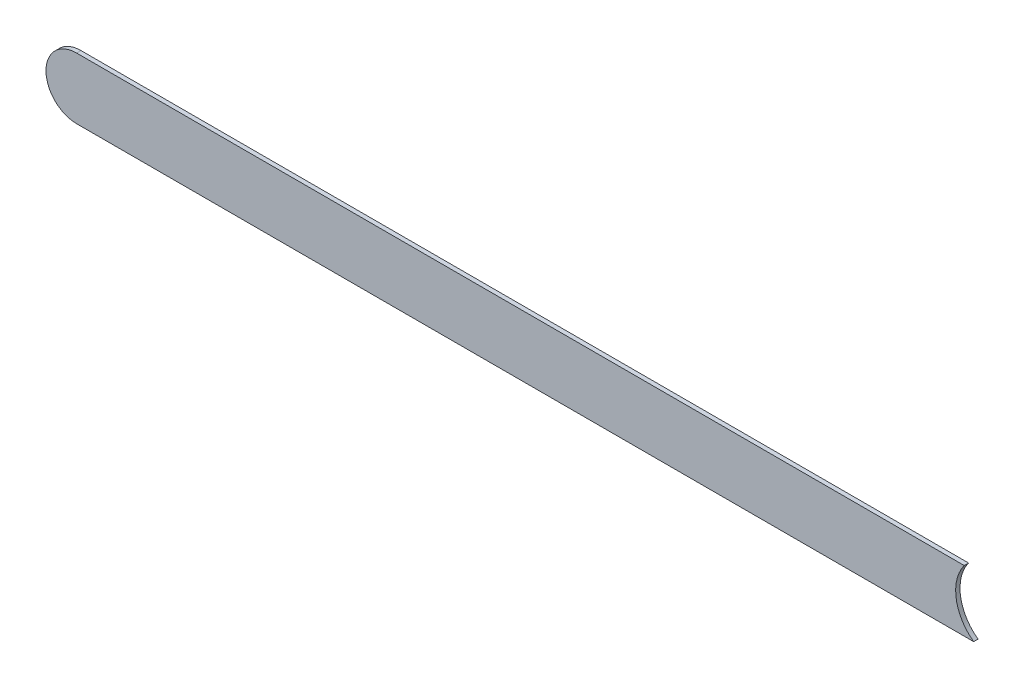
ISO-10303-21;
HEADER;
FILE_DESCRIPTION(('STEP AP214'),'2;1');
FILE_NAME('part.step','',(''),(''),'','','');
FILE_SCHEMA(('AUTOMOTIVE_DESIGN { 1 0 10303 214 1 1 1 1 }'));
ENDSEC;
DATA;
#1=APPLICATION_CONTEXT('core data for automotive mechanical design processes');
#2=APPLICATION_PROTOCOL_DEFINITION('international standard','automotive_design',2000,#1);
#3=PRODUCT_CONTEXT('',#1,'mechanical');
#4=PRODUCT('Part','Part','',(#3));
#5=PRODUCT_RELATED_PRODUCT_CATEGORY('part','',(#4));
#6=PRODUCT_DEFINITION_FORMATION('','',#4);
#7=PRODUCT_DEFINITION_CONTEXT('part definition',#1,'design');
#8=PRODUCT_DEFINITION('design','',#6,#7);
#9=PRODUCT_DEFINITION_SHAPE('','',#8);
#10=(LENGTH_UNIT() NAMED_UNIT(*) SI_UNIT(.MILLI.,.METRE.));
#11=(NAMED_UNIT(*) PLANE_ANGLE_UNIT() SI_UNIT($,.RADIAN.));
#12=(NAMED_UNIT(*) SI_UNIT($,.STERADIAN.) SOLID_ANGLE_UNIT());
#13=UNCERTAINTY_MEASURE_WITH_UNIT(LENGTH_MEASURE(1.E-05),#10,'distance_accuracy_value','');
#14=(GEOMETRIC_REPRESENTATION_CONTEXT(3) GLOBAL_UNCERTAINTY_ASSIGNED_CONTEXT((#13)) GLOBAL_UNIT_ASSIGNED_CONTEXT((#10,
#11,#12)) REPRESENTATION_CONTEXT('',''));
#15=CARTESIAN_POINT('',(0.,0.,0.));
#16=DIRECTION('',(0.,0.,1.));
#17=DIRECTION('',(1.,0.,0.));
#18=AXIS2_PLACEMENT_3D('',#15,#16,#17);
#19=CARTESIAN_POINT('',(49.36500414,97.71201184,0.));
#20=DIRECTION('',(0.,1.,0.));
#21=DIRECTION('',(1.,0.,0.));
#22=AXIS2_PLACEMENT_3D('',#19,#20,#21);
#23=PLANE('',#22);
#24=DIRECTION('',(1.,0.,0.));
#25=VECTOR('',#24,1.);
#26=CARTESIAN_POINT('',(49.36500414,97.71201184,0.03556));
#27=LINE('',#26,#25);
#28=CARTESIAN_POINT('',(49.36500414,97.71201184,0.03556));
#29=VERTEX_POINT('',#28);
#30=CARTESIAN_POINT('',(56.6913993935559,97.71201184,0.03556));
#31=VERTEX_POINT('',#30);
#32=EDGE_CURVE('E11',#29,#31,#27,.T.);
#33=ORIENTED_EDGE('',*,*,#32,.F.);
#34=DIRECTION('',(0.,0.,1.));
#35=VECTOR('',#34,1.);
#36=CARTESIAN_POINT('',(49.36500414,97.71201184,0.));
#37=LINE('',#36,#35);
#38=CARTESIAN_POINT('',(49.36500414,97.71201184,0.));
#39=VERTEX_POINT('',#38);
#40=EDGE_CURVE('E24',#39,#29,#37,.T.);
#41=ORIENTED_EDGE('',*,*,#40,.F.);
#42=DIRECTION('',(1.,0.,0.));
#43=VECTOR('',#42,1.);
#44=CARTESIAN_POINT('',(49.36500414,97.71201184,0.));
#45=LINE('',#44,#43);
#46=CARTESIAN_POINT('',(56.6913993935559,97.71201184,0.));
#47=VERTEX_POINT('',#46);
#48=EDGE_CURVE('E75',#39,#47,#45,.T.);
#49=ORIENTED_EDGE('',*,*,#48,.T.);
#50=DIRECTION('',(0.,0.,1.));
#51=VECTOR('',#50,1.);
#52=CARTESIAN_POINT('',(56.6913993935559,97.71201184,0.));
#53=LINE('',#52,#51);
#54=EDGE_CURVE('E37',#47,#31,#53,.T.);
#55=ORIENTED_EDGE('',*,*,#54,.T.);
#56=EDGE_LOOP('',(#33,#41,#49,#55));
#57=FACE_BOUND('',#56,.T.);
#58=ADVANCED_FACE('F17',(#57),#23,.F.);
#59=CARTESIAN_POINT('',(56.9000005,97.99999958,0.));
#60=DIRECTION('',(0.,0.,-1.));
#61=DIRECTION('',(1.,0.,0.));
#62=AXIS2_PLACEMENT_3D('',#59,#60,#61);
#63=CYLINDRICAL_SURFACE('',#62,0.3556);
#64=DIRECTION('',(0.,0.,1.));
#65=VECTOR('',#64,1.);
#66=CARTESIAN_POINT('',(56.6145139230245,98.21201084,0.));
#67=LINE('',#66,#65);
#68=CARTESIAN_POINT('',(56.6145139230245,98.21201084,0.));
#69=VERTEX_POINT('',#68);
#70=CARTESIAN_POINT('',(56.6145139230245,98.21201084,0.03556));
#71=VERTEX_POINT('',#70);
#72=EDGE_CURVE('E67',#69,#71,#67,.T.);
#73=ORIENTED_EDGE('',*,*,#72,.T.);
#74=CARTESIAN_POINT('',(56.9000005,97.99999958,0.03556));
#75=DIRECTION('',(0.,0.,1.));
#76=DIRECTION('',(1.,0.,0.));
#77=AXIS2_PLACEMENT_3D('',#74,#75,#76);
#78=CIRCLE('',#77,0.3556);
#79=EDGE_CURVE('E82',#71,#31,#78,.T.);
#80=ORIENTED_EDGE('',*,*,#79,.T.);
#81=ORIENTED_EDGE('',*,*,#54,.F.);
#82=CARTESIAN_POINT('',(56.9000005,97.99999958,0.));
#83=DIRECTION('',(0.,0.,1.));
#84=DIRECTION('',(1.,0.,0.));
#85=AXIS2_PLACEMENT_3D('',#82,#83,#84);
#86=CIRCLE('',#85,0.3556);
#87=EDGE_CURVE('E80',#69,#47,#86,.T.);
#88=ORIENTED_EDGE('',*,*,#87,.F.);
#89=EDGE_LOOP('',(#73,#80,#81,#88));
#90=FACE_BOUND('',#89,.T.);
#91=ADVANCED_FACE('F88',(#90),#63,.F.);
#92=CARTESIAN_POINT('',(56.6145139230245,98.21201084,0.));
#93=DIRECTION('',(0.,-1.,0.));
#94=DIRECTION('',(-1.,0.,0.));
#95=AXIS2_PLACEMENT_3D('',#92,#93,#94);
#96=PLANE('',#95);
#97=DIRECTION('',(-1.,0.,0.));
#98=VECTOR('',#97,1.);
#99=CARTESIAN_POINT('',(56.86201226,98.21201084,0.03556));
#100=LINE('',#99,#98);
#101=CARTESIAN_POINT('',(49.36500414,98.21201084,0.03556));
#102=VERTEX_POINT('',#101);
#103=EDGE_CURVE('E71',#71,#102,#100,.T.);
#104=ORIENTED_EDGE('',*,*,#103,.F.);
#105=ORIENTED_EDGE('',*,*,#72,.F.);
#106=DIRECTION('',(-1.,0.,0.));
#107=VECTOR('',#106,1.);
#108=CARTESIAN_POINT('',(56.86201226,98.21201084,0.));
#109=LINE('',#108,#107);
#110=CARTESIAN_POINT('',(49.36500414,98.21201084,0.));
#111=VERTEX_POINT('',#110);
#112=EDGE_CURVE('E63',#69,#111,#109,.T.);
#113=ORIENTED_EDGE('',*,*,#112,.T.);
#114=DIRECTION('',(0.,0.,1.));
#115=VECTOR('',#114,1.);
#116=CARTESIAN_POINT('',(49.36500414,98.21201084,0.));
#117=LINE('',#116,#115);
#118=EDGE_CURVE('E53',#111,#102,#117,.T.);
#119=ORIENTED_EDGE('',*,*,#118,.T.);
#120=EDGE_LOOP('',(#104,#105,#113,#119));
#121=FACE_BOUND('',#120,.T.);
#122=ADVANCED_FACE('F66',(#121),#96,.F.);
#123=CARTESIAN_POINT('',(49.36500414,97.96201134,0.));
#124=DIRECTION('',(0.,0.,-1.));
#125=DIRECTION('',(0.,1.,0.));
#126=AXIS2_PLACEMENT_3D('',#123,#124,#125);
#127=CYLINDRICAL_SURFACE('',#126,0.249999499999999);
#128=CARTESIAN_POINT('',(49.36500414,97.96201134,0.03556));
#129=DIRECTION('',(0.,0.,1.));
#130=DIRECTION('',(0.,1.,0.));
#131=AXIS2_PLACEMENT_3D('',#128,#129,#130);
#132=CIRCLE('',#131,0.249999499999999);
#133=EDGE_CURVE('E59',#102,#29,#132,.T.);
#134=ORIENTED_EDGE('',*,*,#133,.F.);
#135=ORIENTED_EDGE('',*,*,#118,.F.);
#136=CARTESIAN_POINT('',(49.36500414,97.96201134,0.));
#137=DIRECTION('',(0.,0.,1.));
#138=DIRECTION('',(0.,1.,0.));
#139=AXIS2_PLACEMENT_3D('',#136,#137,#138);
#140=CIRCLE('',#139,0.249999499999999);
#141=EDGE_CURVE('E57',#111,#39,#140,.T.);
#142=ORIENTED_EDGE('',*,*,#141,.T.);
#143=ORIENTED_EDGE('',*,*,#40,.T.);
#144=EDGE_LOOP('',(#134,#135,#142,#143));
#145=FACE_BOUND('',#144,.T.);
#146=ADVANCED_FACE('F55',(#145),#127,.T.);
#147=CARTESIAN_POINT('',(49.36500414,97.71201184,0.));
#148=DIRECTION('',(0.,0.,-1.));
#149=DIRECTION('',(-1.,0.,0.));
#150=AXIS2_PLACEMENT_3D('',#147,#148,#149);
#151=PLANE('',#150);
#152=ORIENTED_EDGE('',*,*,#48,.F.);
#153=ORIENTED_EDGE('',*,*,#141,.F.);
#154=ORIENTED_EDGE('',*,*,#112,.F.);
#155=ORIENTED_EDGE('',*,*,#87,.T.);
#156=EDGE_LOOP('',(#152,#153,#154,#155));
#157=FACE_BOUND('',#156,.T.);
#158=ADVANCED_FACE('F74',(#157),#151,.T.);
#159=CARTESIAN_POINT('',(49.36500414,97.71201184,0.03556));
#160=DIRECTION('',(0.,0.,-1.));
#161=DIRECTION('',(-1.,0.,0.));
#162=AXIS2_PLACEMENT_3D('',#159,#160,#161);
#163=PLANE('',#162);
#164=ORIENTED_EDGE('',*,*,#133,.T.);
#165=ORIENTED_EDGE('',*,*,#32,.T.);
#166=ORIENTED_EDGE('',*,*,#79,.F.);
#167=ORIENTED_EDGE('',*,*,#103,.T.);
#168=EDGE_LOOP('',(#164,#165,#166,#167));
#169=FACE_BOUND('',#168,.T.);
#170=ADVANCED_FACE('F91',(#169),#163,.F.);
#171=CLOSED_SHELL('',(#58,#91,#122,#146,#158,#170));
#172=MANIFOLD_SOLID_BREP('B1',#171);
#173=ADVANCED_BREP_SHAPE_REPRESENTATION('',(#18,#172),#14);
#174=SHAPE_DEFINITION_REPRESENTATION(#9,#173);
ENDSEC;
END-ISO-10303-21;
